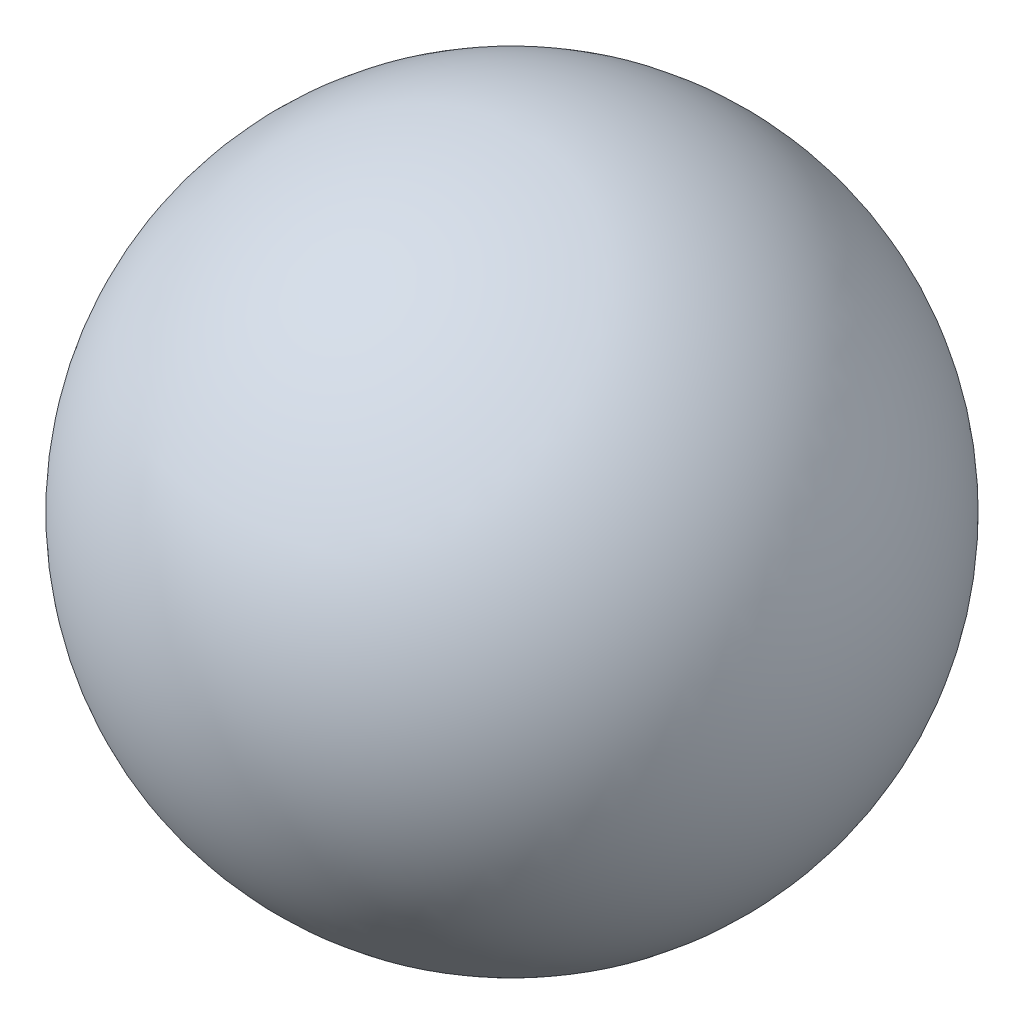
ISO-10303-21;
HEADER;
FILE_DESCRIPTION(('STEP AP214'),'2;1');
FILE_NAME('part.step','',(''),(''),'','','');
FILE_SCHEMA(('AUTOMOTIVE_DESIGN { 1 0 10303 214 1 1 1 1 }'));
ENDSEC;
DATA;
#1=APPLICATION_CONTEXT('core data for automotive mechanical design processes');
#2=APPLICATION_PROTOCOL_DEFINITION('international standard','automotive_design',2000,#1);
#3=PRODUCT_CONTEXT('',#1,'mechanical');
#4=PRODUCT('Part','Part','',(#3));
#5=PRODUCT_RELATED_PRODUCT_CATEGORY('part','',(#4));
#6=PRODUCT_DEFINITION_FORMATION('','',#4);
#7=PRODUCT_DEFINITION_CONTEXT('part definition',#1,'design');
#8=PRODUCT_DEFINITION('design','',#6,#7);
#9=PRODUCT_DEFINITION_SHAPE('','',#8);
#10=(LENGTH_UNIT() NAMED_UNIT(*) SI_UNIT(.MILLI.,.METRE.));
#11=(NAMED_UNIT(*) PLANE_ANGLE_UNIT() SI_UNIT($,.RADIAN.));
#12=(NAMED_UNIT(*) SI_UNIT($,.STERADIAN.) SOLID_ANGLE_UNIT());
#13=UNCERTAINTY_MEASURE_WITH_UNIT(LENGTH_MEASURE(1.E-05),#10,'distance_accuracy_value','');
#14=(GEOMETRIC_REPRESENTATION_CONTEXT(3) GLOBAL_UNCERTAINTY_ASSIGNED_CONTEXT((#13)) GLOBAL_UNIT_ASSIGNED_CONTEXT((#10,
#11,#12)) REPRESENTATION_CONTEXT('',''));
#15=CARTESIAN_POINT('',(0.,0.,0.));
#16=DIRECTION('',(0.,0.,1.));
#17=DIRECTION('',(1.,0.,0.));
#18=AXIS2_PLACEMENT_3D('',#15,#16,#17);
#19=CARTESIAN_POINT('',(0.,30.,0.));
#20=DIRECTION('',(0.,-1.,0.));
#21=DIRECTION('',(-1.,0.,0.));
#22=AXIS2_PLACEMENT_3D('',#19,#20,#21);
#23=SPHERICAL_SURFACE('',#22,30.);
#24=CARTESIAN_POINT('',(0.,0.,0.));
#25=VERTEX_POINT('',#24);
#26=VERTEX_LOOP('',#25);
#27=FACE_BOUND('',#26,.T.);
#28=ADVANCED_FACE('F39',(#27),#23,.T.);
#29=CLOSED_SHELL('',(#28));
#30=MANIFOLD_SOLID_BREP('B2',#29);
#31=ADVANCED_BREP_SHAPE_REPRESENTATION('',(#18,#30),#14);
#32=SHAPE_DEFINITION_REPRESENTATION(#9,#31);
ENDSEC;
END-ISO-10303-21;
